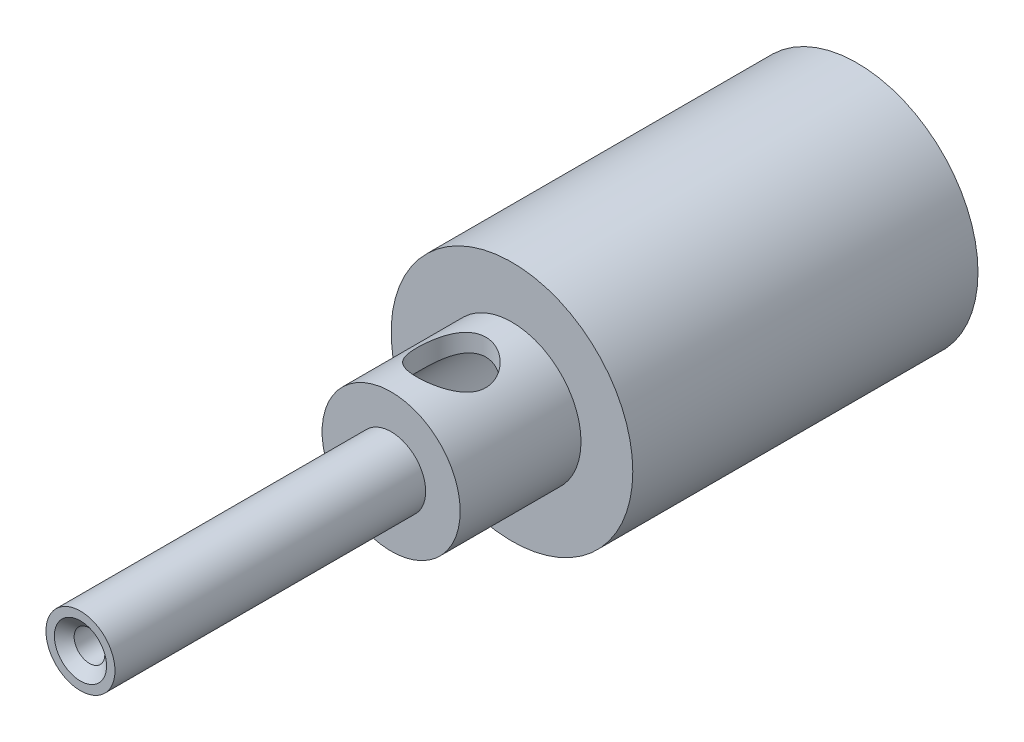
ISO-10303-21;
HEADER;
FILE_DESCRIPTION(('STEP AP214'),'2;1');
FILE_NAME('part.step','',(''),(''),'','','');
FILE_SCHEMA(('AUTOMOTIVE_DESIGN { 1 0 10303 214 1 1 1 1 }'));
ENDSEC;
DATA;
#1=APPLICATION_CONTEXT('core data for automotive mechanical design processes');
#2=APPLICATION_PROTOCOL_DEFINITION('international standard','automotive_design',2000,#1);
#3=PRODUCT_CONTEXT('',#1,'mechanical');
#4=PRODUCT('Part','Part','',(#3));
#5=PRODUCT_RELATED_PRODUCT_CATEGORY('part','',(#4));
#6=PRODUCT_DEFINITION_FORMATION('','',#4);
#7=PRODUCT_DEFINITION_CONTEXT('part definition',#1,'design');
#8=PRODUCT_DEFINITION('design','',#6,#7);
#9=PRODUCT_DEFINITION_SHAPE('','',#8);
#10=(LENGTH_UNIT() NAMED_UNIT(*) SI_UNIT(.MILLI.,.METRE.));
#11=(NAMED_UNIT(*) PLANE_ANGLE_UNIT() SI_UNIT($,.RADIAN.));
#12=(NAMED_UNIT(*) SI_UNIT($,.STERADIAN.) SOLID_ANGLE_UNIT());
#13=UNCERTAINTY_MEASURE_WITH_UNIT(LENGTH_MEASURE(1.E-05),#10,'distance_accuracy_value','');
#14=(GEOMETRIC_REPRESENTATION_CONTEXT(3) GLOBAL_UNCERTAINTY_ASSIGNED_CONTEXT((#13)) GLOBAL_UNIT_ASSIGNED_CONTEXT((#10,
#11,#12)) REPRESENTATION_CONTEXT('',''));
#15=CARTESIAN_POINT('',(0.,0.,0.));
#16=DIRECTION('',(0.,0.,1.));
#17=DIRECTION('',(1.,0.,0.));
#18=AXIS2_PLACEMENT_3D('',#15,#16,#17);
#19=CARTESIAN_POINT('',(0.,32.,23.5116221591236));
#20=DIRECTION('',(0.,-1.,0.));
#21=DIRECTION('',(0.,0.,-1.));
#22=AXIS2_PLACEMENT_3D('',#19,#20,#21);
#23=CYLINDRICAL_SURFACE('',#22,2.);
#24=CARTESIAN_POINT('',(0.,4.,21.5116221591236));
#25=CARTESIAN_POINT('',(-0.105143925902467,3.99999426810082,21.5116287637579));
#26=CARTESIAN_POINT('',(-0.210413199395125,3.99580982039513,21.5199623053657));
#27=CARTESIAN_POINT('',(-0.417840470537792,3.97948312074314,21.5529279198066));
#28=CARTESIAN_POINT('',(-0.519992173427259,3.96732575657839,21.5775909451192));
#29=CARTESIAN_POINT('',(-0.717867089760898,3.93632558806751,21.6420097763568));
#30=CARTESIAN_POINT('',(-0.813613605878293,3.91750878355075,21.6817069276195));
#31=CARTESIAN_POINT('',(-0.996945233613198,3.87491553031523,21.7747634018535));
#32=CARTESIAN_POINT('',(-1.08453098798012,3.8511394726705,21.8281216476213));
#33=CARTESIAN_POINT('',(-1.25501563552382,3.79912516516124,21.9506566580941));
#34=CARTESIAN_POINT('',(-1.33731042224422,3.77070398255074,22.0205951176028));
#35=CARTESIAN_POINT('',(-1.48955888973396,3.71319940493486,22.1726651176176));
#36=CARTESIAN_POINT('',(-1.55950316621354,3.68411552418069,22.2548058626684));
#37=CARTESIAN_POINT('',(-1.69050400090056,3.62597902394695,22.4365888581703));
#38=CARTESIAN_POINT('',(-1.75045067110328,3.59710373940264,22.5370943558154));
#39=CARTESIAN_POINT('',(-1.85233645378139,3.54571957544641,22.748356831096));
#40=CARTESIAN_POINT('',(-1.89428842993267,3.52320615213979,22.8591064165691));
#41=CARTESIAN_POINT('',(-1.95626488437718,3.48915734075617,23.0809523699674));
#42=CARTESIAN_POINT('',(-1.97745171416088,3.47704543167427,23.1916310632584));
#43=CARTESIAN_POINT('',(-2.00085398661769,3.46363779897055,23.4155798346825));
#44=CARTESIAN_POINT('',(-2.00308817674615,3.46233138686576,23.5288472408659));
#45=CARTESIAN_POINT('',(-1.98937457434459,3.47021860514497,23.7401942077543));
#46=CARTESIAN_POINT('',(-1.97556911907364,3.47817527324027,23.8384702215697));
#47=CARTESIAN_POINT('',(-1.93387969811386,3.50152457467701,24.0310659778697));
#48=CARTESIAN_POINT('',(-1.9059912477953,3.51691957663553,24.1253844497342));
#49=CARTESIAN_POINT('',(-1.83641956077201,3.55374952825482,24.3100804242549));
#50=CARTESIAN_POINT('',(-1.79443013423199,3.57531681327997,24.4003149566951));
#51=CARTESIAN_POINT('',(-1.69808337533601,3.62206808562807,24.5728907443036));
#52=CARTESIAN_POINT('',(-1.64372048762494,3.64725369560381,24.6552284303237));
#53=CARTESIAN_POINT('',(-1.51613210982558,3.70226315806572,24.82066466461));
#54=CARTESIAN_POINT('',(-1.44138891673856,3.73227020473492,24.9025359062759));
#55=CARTESIAN_POINT('',(-1.27911115748275,3.79095246600814,25.0530929963054));
#56=CARTESIAN_POINT('',(-1.19157051314857,3.81962703917602,25.1217725431913));
#57=CARTESIAN_POINT('',(-1.0010330116637,3.87403974565928,25.246993481183));
#58=CARTESIAN_POINT('',(-0.897507183198815,3.89957968324014,25.302823104015));
#59=CARTESIAN_POINT('',(-0.680932430977591,3.94315762242485,25.3958162172096));
#60=CARTESIAN_POINT('',(-0.567891152530551,3.96120157887106,25.4329945291539));
#61=CARTESIAN_POINT('',(-0.345532983321405,3.98648667482871,25.4845729665569));
#62=CARTESIAN_POINT('',(-0.236683061096653,3.9944987660262,25.5006046306171));
#63=CARTESIAN_POINT('',(-0.0175591998987033,4.00146026918207,25.5145516213925));
#64=CARTESIAN_POINT('',(0.0927140397398172,4.00041397442637,25.5124755304025));
#65=CARTESIAN_POINT('',(0.302465943971974,3.9898238450687,25.4912087822861));
#66=CARTESIAN_POINT('',(0.402118816099861,3.98094491376337,25.4733570936636));
#67=CARTESIAN_POINT('',(0.596813784603883,3.9564434262968,25.4231460153333));
#68=CARTESIAN_POINT('',(0.691855371382174,3.94082012668824,25.3907850262166));
#69=CARTESIAN_POINT('',(0.877777216899146,3.90368502827176,25.3116252262575));
#70=CARTESIAN_POINT('',(0.968460794011607,3.88201763539261,25.264440058891));
#71=CARTESIAN_POINT('',(1.14092272339854,3.83487948634835,25.1574070878304));
#72=CARTESIAN_POINT('',(1.22269725955318,3.80940711133877,25.0975538899328));
#73=CARTESIAN_POINT('',(1.38353537857843,3.75416442672396,24.9601013084621));
#74=CARTESIAN_POINT('',(1.46154415563805,3.72421769686998,24.8813364222333));
#75=CARTESIAN_POINT('',(1.60371264223771,3.6652478321764,24.7117718565681));
#76=CARTESIAN_POINT('',(1.66786277142375,3.63622534800094,24.6209639214277));
#77=CARTESIAN_POINT('',(1.78341582895804,3.58102384412979,24.4243348507776));
#78=CARTESIAN_POINT('',(1.8340509916005,3.55505059178121,24.3179996269346));
#79=CARTESIAN_POINT('',(1.91616565186941,3.51148144588269,24.0966020239736));
#80=CARTESIAN_POINT('',(1.94766983173403,3.493874764435,23.9815511061898));
#81=CARTESIAN_POINT('',(1.98772337493375,3.47123002051604,23.7578017133542));
#82=CARTESIAN_POINT('',(1.9981859928109,3.4651476693013,23.6495536522531));
#83=CARTESIAN_POINT('',(2.0013783087524,3.46330709283206,23.4327280247945));
#84=CARTESIAN_POINT('',(1.99411569324648,3.4675443925278,23.3241506216478));
#85=CARTESIAN_POINT('',(1.96385225118662,3.48475724102153,23.1206551560567));
#86=CARTESIAN_POINT('',(1.94241662868607,3.49686188965317,23.0254212188341));
#87=CARTESIAN_POINT('',(1.88635071644882,3.52742032375305,22.8400059202748));
#88=CARTESIAN_POINT('',(1.85171618231984,3.54587615139337,22.7498261949395));
#89=CARTESIAN_POINT('',(1.76763149060113,3.58857060729071,22.5703724571505));
#90=CARTESIAN_POINT('',(1.7173422756314,3.61311444791841,22.4815663554655));
#91=CARTESIAN_POINT('',(1.60430194327478,3.66470663269721,22.313073086761));
#92=CARTESIAN_POINT('',(1.54154434248312,3.69175627591221,22.2333906980813));
#93=CARTESIAN_POINT('',(1.39640665332275,3.74924646316184,22.0753381944142));
#94=CARTESIAN_POINT('',(1.31256884599452,3.77969966613256,21.998303954423));
#95=CARTESIAN_POINT('',(1.13230961246639,3.83755504519861,21.859096192253));
#96=CARTESIAN_POINT('',(1.03588144661039,3.8649555725239,21.7969306801837));
#97=CARTESIAN_POINT('',(0.831863193565889,3.91396019133075,21.6891494336994));
#98=CARTESIAN_POINT('',(0.72419900755346,3.93552192987866,21.6436538206506));
#99=CARTESIAN_POINT('',(0.501484202276173,3.97002682597974,21.5720058236087));
#100=CARTESIAN_POINT('',(0.386455599178201,3.98299446726136,21.5457984655121));
#101=CARTESIAN_POINT('',(0.225203892981792,3.99390923826956,21.5238273369521));
#102=CARTESIAN_POINT('',(0.18032375888313,3.99618730680502,21.5192568773909));
#103=CARTESIAN_POINT('',(0.0903034636101831,3.99923393953631,21.5131528280954));
#104=CARTESIAN_POINT('',(0.0451632952932568,4.00000246206762,21.5116193221831));
#105=CARTESIAN_POINT('',(0.,4.,21.5116221591236));
#106=B_SPLINE_CURVE_WITH_KNOTS('',3,(#24,#25,#26,#27,#28,#29,#30,#31,#32,#33,#34,#35,#36,#37,
#38,#39,#40,#41,#42,#43,#44,#45,#46,#47,#48,#49,#50,#51,#52,#53,#54,#55,#56,#57,#58,#59,#60,#61,
#62,#63,#64,#65,#66,#67,#68,#69,#70,#71,#72,#73,#74,#75,#76,#77,#78,#79,#80,#81,#82,#83,#84,#85,
#86,#87,#88,#89,#90,#91,#92,#93,#94,#95,#96,#97,#98,#99,#100,#101,#102,#103,#104,#105),
.UNSPECIFIED.,.T.,.F.,(4,2,2,2,2,2,2,2,2,2,2,2,2,2,2,2,2,2,2,2,2,2,2,2,2,2,2,2,2,2,2,2,2,2,2,2,
2,2,2,2,4),(0.,0.315248514840585,0.631096299418396,0.945724310984597,1.26032752116314,
1.59396351743618,1.92785247530807,2.28763452861506,2.64715895796562,2.98516024280459,
3.32282714658041,3.62011424818642,3.91749607851357,4.22180480336975,4.52625042520444,
4.86929882667757,5.21251069197373,5.57166044428882,5.93052433824559,6.25966580942691,
6.58865129022952,6.89213813012244,7.19565843261863,7.50785712055798,7.82018901496679,
8.16319221288838,8.50643177230864,8.86629364323452,9.22569023890902,9.55058615006093,
9.87534119729357,10.1691586049771,10.463070575767,10.7767291356057,11.0905512228726,
11.4425048551434,11.7946476676249,12.1492802732705,12.502898172423,12.6383056026783,
12.7737167702213),.UNSPECIFIED.);
#107=CARTESIAN_POINT('',(0.,4.,21.5116221591236));
#108=VERTEX_POINT('',#107);
#109=EDGE_CURVE('E63',#108,#108,#106,.T.);
#110=ORIENTED_EDGE('',*,*,#109,.T.);
#111=EDGE_LOOP('',(#110));
#112=FACE_BOUND('',#111,.T.);
#113=CARTESIAN_POINT('',(0.,3.,21.5116221591236));
#114=CARTESIAN_POINT('',(0.100484716668078,3.0000004164484,21.5116216094911));
#115=CARTESIAN_POINT('',(0.200969087132901,2.99490802753388,21.5192361290791));
#116=CARTESIAN_POINT('',(0.398733058031681,2.97504652423809,21.5492190232292));
#117=CARTESIAN_POINT('',(0.496011113955007,2.96027281581235,21.5715944022469));
#118=CARTESIAN_POINT('',(0.684212307854249,2.92250482404708,21.6297298764484));
#119=CARTESIAN_POINT('',(0.775162872657554,2.89954905493315,21.6654272991315));
#120=CARTESIAN_POINT('',(0.94941529099726,2.8472613787744,21.7486855223951));
#121=CARTESIAN_POINT('',(1.03271603160967,2.8179285460551,21.7962480454241));
#122=CARTESIAN_POINT('',(1.19728470077011,2.75227329369838,21.906279096491));
#123=CARTESIAN_POINT('',(1.27778030546068,2.71556897579319,21.9696700198665));
#124=CARTESIAN_POINT('',(1.42772804469274,2.63982313083466,22.107352207782));
#125=CARTESIAN_POINT('',(1.49716405543888,2.60077830356832,22.1816590889613));
#126=CARTESIAN_POINT('',(1.63422297745496,2.51728264678794,22.3526745267362));
#127=CARTESIAN_POINT('',(1.6998318636275,2.47295067937795,22.451067812327));
#128=CARTESIAN_POINT('',(1.81350357014175,2.3908414735282,22.6599855367701));
#129=CARTESIAN_POINT('',(1.86159673426503,2.35305295954668,22.7704885606863));
#130=CARTESIAN_POINT('',(1.92674035011438,2.29976266641461,22.9683334525452));
#131=CARTESIAN_POINT('',(1.94874447236008,2.28097627892403,23.0531506119975));
#132=CARTESIAN_POINT('',(1.98150617785228,2.25257969659604,23.2263666638652));
#133=CARTESIAN_POINT('',(1.99228314651963,2.24295368744147,23.3147591078496));
#134=CARTESIAN_POINT('',(2.00191364141227,2.23436605608045,23.49309693798));
#135=CARTESIAN_POINT('',(2.00071842917524,2.23544802558502,23.583047182576));
#136=CARTESIAN_POINT('',(1.98637581333356,2.24819775483425,23.7612571326233));
#137=CARTESIAN_POINT('',(1.97321828380393,2.25987448286881,23.8495153411517));
#138=CARTESIAN_POINT('',(1.93664994217326,2.29127185989959,24.0180892103654));
#139=CARTESIAN_POINT('',(1.91371711479477,2.31061488324375,24.0985834950623));
#140=CARTESIAN_POINT('',(1.85870118583424,2.35509622933623,24.2546458500993));
#141=CARTESIAN_POINT('',(1.8266150732855,2.3802364585489,24.3302122893622));
#142=CARTESIAN_POINT('',(1.74673818732648,2.43964196377947,24.49064755448));
#143=CARTESIAN_POINT('',(1.69708052300445,2.47472317740626,24.5742820596067));
#144=CARTESIAN_POINT('',(1.58668960438221,2.54691537733438,24.7330055544093));
#145=CARTESIAN_POINT('',(1.52594268999614,2.58402882709328,24.8080838168856));
#146=CARTESIAN_POINT('',(1.37981165322309,2.66543343763724,24.964164704727));
#147=CARTESIAN_POINT('',(1.29193938283656,2.7095474472056,25.0429562078063));
#148=CARTESIAN_POINT('',(1.10200799908008,2.79218100665212,25.184818653662));
#149=CARTESIAN_POINT('',(0.999962299343698,2.83070577648042,25.2479043045325));
#150=CARTESIAN_POINT('',(0.80485782709653,2.89145404090364,25.3450998777464));
#151=CARTESIAN_POINT('',(0.713957643371909,2.9153926116554,25.3824655224625));
#152=CARTESIAN_POINT('',(0.526036043935479,2.95507719030499,25.4437270847489));
#153=CARTESIAN_POINT('',(0.429019879001649,2.97083012127543,25.4676343862558));
#154=CARTESIAN_POINT('',(0.23098545317228,2.99275882156808,25.5007833243616));
#155=CARTESIAN_POINT('',(0.129951811934157,2.99889322461187,25.5099616200618));
#156=CARTESIAN_POINT('',(-0.0724415193893482,3.00083114965147,25.5128692476858));
#157=CARTESIAN_POINT('',(-0.173801186186627,2.99663539385634,25.5065996596123));
#158=CARTESIAN_POINT('',(-0.366455717204241,2.97899589424273,25.4799981035616));
#159=CARTESIAN_POINT('',(-0.457957444679195,2.96622246390226,25.4606848613683));
#160=CARTESIAN_POINT('',(-0.636116392427403,2.93318449284837,25.4100264731107));
#161=CARTESIAN_POINT('',(-0.722772837571135,2.91291875746989,25.3786794081954));
#162=CARTESIAN_POINT('',(-0.894664750465998,2.86496352529158,25.3029698620786));
#163=CARTESIAN_POINT('',(-0.979496184631421,2.83689870135785,25.2579340050417));
#164=CARTESIAN_POINT('',(-1.14068302395729,2.7760185561151,25.1571888691773));
#165=CARTESIAN_POINT('',(-1.21703314820091,2.74320030403941,25.1014729985914));
#166=CARTESIAN_POINT('',(-1.37185445482324,2.6695454665343,24.9710142909661));
#167=CARTESIAN_POINT('',(-1.44875187569565,2.62826156800165,24.8946558990485));
#168=CARTESIAN_POINT('',(-1.58933968069449,2.54571173085958,24.7305107291665));
#169=CARTESIAN_POINT('',(-1.6530209365723,2.50444582417845,24.6427161200161));
#170=CARTESIAN_POINT('',(-1.76124776549313,2.4293967897058,24.4644797463554));
#171=CARTESIAN_POINT('',(-1.80695636125283,2.39527597025701,24.3748901256614));
#172=CARTESIAN_POINT('',(-1.88496213740264,2.33438974266154,24.1877495066799));
#173=CARTESIAN_POINT('',(-1.91728345682189,2.30761112529822,24.0902132208189));
#174=CARTESIAN_POINT('',(-1.9623584346534,2.26933208182633,23.9070576719282));
#175=CARTESIAN_POINT('',(-1.97758597566225,2.25594998021257,23.8224503492476));
#176=CARTESIAN_POINT('',(-1.99699205923373,2.23879466438398,23.6510488778052));
#177=CARTESIAN_POINT('',(-2.00118260285317,2.23501101347816,23.5642572079841));
#178=CARTESIAN_POINT('',(-1.99823921981266,2.23764201149981,23.3909791023999));
#179=CARTESIAN_POINT('',(-1.99109858767783,2.24406269907463,23.3044928777498));
#180=CARTESIAN_POINT('',(-1.96596997224746,2.26610452403491,23.1342786305915));
#181=CARTESIAN_POINT('',(-1.94796751728258,2.28173793527615,23.0505544452992));
#182=CARTESIAN_POINT('',(-1.89593035657494,2.32526843904801,22.8659109726423));
#183=CARTESIAN_POINT('',(-1.85890187130765,2.35532333574983,22.7663544461802));
#184=CARTESIAN_POINT('',(-1.7708452623622,2.42222161121309,22.5761353247394));
#185=CARTESIAN_POINT('',(-1.71979748341259,2.459074496867,22.4854854611319));
#186=CARTESIAN_POINT('',(-1.60398280555152,2.53617186577119,22.3123402719873));
#187=CARTESIAN_POINT('',(-1.53898309894021,2.5764658739228,22.2300234137005));
#188=CARTESIAN_POINT('',(-1.39671768031094,2.65628301537844,22.0762996808656));
#189=CARTESIAN_POINT('',(-1.31944821025748,2.69580590832396,22.0048961620944));
#190=CARTESIAN_POINT('',(-1.14145732976974,2.77631551964082,21.8649100548145));
#191=CARTESIAN_POINT('',(-1.03896166955574,2.81669805449991,21.7982035189452));
#192=CARTESIAN_POINT('',(-0.820868555771212,2.88777665874161,21.6837088824583));
#193=CARTESIAN_POINT('',(-0.705292062449151,2.91848793445255,21.6358910522996));
#194=CARTESIAN_POINT('',(-0.491435069835739,2.96101644836895,21.5704675809598));
#195=CARTESIAN_POINT('',(-0.395012325257916,2.97551480368935,21.5485111200249));
#196=CARTESIAN_POINT('',(-0.199058012023943,2.99500280141853,21.5190941265855));
#197=CARTESIAN_POINT('',(-0.0995288361880063,2.99999958751315,21.5116227035276));
#198=CARTESIAN_POINT('',(0.,3.,21.5116221591236));
#199=B_SPLINE_CURVE_WITH_KNOTS('',3,(#113,#114,#115,#116,#117,#118,#119,#120,#121,#122,#123,
#124,#125,#126,#127,#128,#129,#130,#131,#132,#133,#134,#135,#136,#137,#138,#139,#140,#141,#142,
#143,#144,#145,#146,#147,#148,#149,#150,#151,#152,#153,#154,#155,#156,#157,#158,#159,#160,#161,
#162,#163,#164,#165,#166,#167,#168,#169,#170,#171,#172,#173,#174,#175,#176,#177,#178,#179,#180,
#181,#182,#183,#184,#185,#186,#187,#188,#189,#190,#191,#192,#193,#194,#195,#196,#197,#198),
.UNSPECIFIED.,.T.,.F.,(4,2,2,2,2,2,2,2,2,2,2,2,2,2,2,2,2,2,2,2,2,2,2,2,2,2,2,2,2,2,2,2,2,2,2,2,
2,2,2,2,2,2,4),(0.,0.3010532265054,0.602249414348689,0.902046153190232,1.20188643867386,
1.52717029000557,1.85292411604319,2.23006683295983,2.60655305445439,2.87433693676029,
3.14165767845809,3.41006711735378,3.67870397263352,3.93548862198022,4.19235783805079,
4.50147574660874,4.81097703780057,5.18718954496752,5.56304840301363,5.86524087696758,
6.16717735142814,6.47040883294251,6.77361911533415,7.05553084792473,7.33748755138271,
7.63652346829516,7.93574454945204,8.28228176141291,8.62905753175758,8.94649935304477,
9.26336626640724,9.52324048016135,9.78283200333092,10.0425772028455,10.302669238524,
10.6320660870419,10.9619271337795,11.2977924520448,11.6337608397015,12.0179535155883,
12.4015390656083,12.6999529136675,12.9981423125957),.UNSPECIFIED.);
#200=CARTESIAN_POINT('',(0.,3.,21.5116221591236));
#201=VERTEX_POINT('',#200);
#202=EDGE_CURVE('E110',#201,#201,#199,.T.);
#203=ORIENTED_EDGE('',*,*,#202,.T.);
#204=EDGE_LOOP('',(#203));
#205=FACE_BOUND('',#204,.T.);
#206=ADVANCED_FACE('F34',(#112,#205),#23,.F.);
#207=CARTESIAN_POINT('',(0.,-4.,21.5116221591236));
#208=CARTESIAN_POINT('',(0.105143925902467,-3.99999426810082,21.5116287637579));
#209=CARTESIAN_POINT('',(0.210413199395125,-3.99580982039513,21.5199623053657));
#210=CARTESIAN_POINT('',(0.417840470537792,-3.97948312074314,21.5529279198066));
#211=CARTESIAN_POINT('',(0.519992173427259,-3.96732575657839,21.5775909451192));
#212=CARTESIAN_POINT('',(0.717867089760898,-3.93632558806751,21.6420097763568));
#213=CARTESIAN_POINT('',(0.813613605878293,-3.91750878355075,21.6817069276195));
#214=CARTESIAN_POINT('',(0.996945233613198,-3.87491553031523,21.7747634018535));
#215=CARTESIAN_POINT('',(1.08453098798012,-3.8511394726705,21.8281216476213));
#216=CARTESIAN_POINT('',(1.25501563552382,-3.79912516516124,21.9506566580941));
#217=CARTESIAN_POINT('',(1.33731042224422,-3.77070398255074,22.0205951176028));
#218=CARTESIAN_POINT('',(1.48955888973396,-3.71319940493486,22.1726651176176));
#219=CARTESIAN_POINT('',(1.55950316621354,-3.68411552418069,22.2548058626684));
#220=CARTESIAN_POINT('',(1.69050400090056,-3.62597902394695,22.4365888581703));
#221=CARTESIAN_POINT('',(1.75045067110328,-3.59710373940264,22.5370943558154));
#222=CARTESIAN_POINT('',(1.85233645378139,-3.54571957544641,22.748356831096));
#223=CARTESIAN_POINT('',(1.89428842993267,-3.52320615213979,22.8591064165691));
#224=CARTESIAN_POINT('',(1.95626488437718,-3.48915734075617,23.0809523699674));
#225=CARTESIAN_POINT('',(1.97745171416088,-3.47704543167427,23.1916310632584));
#226=CARTESIAN_POINT('',(2.00085398661769,-3.46363779897055,23.4155798346825));
#227=CARTESIAN_POINT('',(2.00308817674615,-3.46233138686576,23.5288472408659));
#228=CARTESIAN_POINT('',(1.98937457434459,-3.47021860514497,23.7401942077543));
#229=CARTESIAN_POINT('',(1.97556911907364,-3.47817527324027,23.8384702215697));
#230=CARTESIAN_POINT('',(1.93387969811386,-3.50152457467701,24.0310659778697));
#231=CARTESIAN_POINT('',(1.9059912477953,-3.51691957663553,24.1253844497342));
#232=CARTESIAN_POINT('',(1.83641956077201,-3.55374952825482,24.3100804242549));
#233=CARTESIAN_POINT('',(1.79443013423199,-3.57531681327997,24.4003149566951));
#234=CARTESIAN_POINT('',(1.69808337533601,-3.62206808562807,24.5728907443036));
#235=CARTESIAN_POINT('',(1.64372048762494,-3.64725369560381,24.6552284303237));
#236=CARTESIAN_POINT('',(1.51613210982558,-3.70226315806572,24.82066466461));
#237=CARTESIAN_POINT('',(1.44138891673856,-3.73227020473492,24.9025359062759));
#238=CARTESIAN_POINT('',(1.27911115748275,-3.79095246600814,25.0530929963054));
#239=CARTESIAN_POINT('',(1.19157051314857,-3.81962703917602,25.1217725431913));
#240=CARTESIAN_POINT('',(1.0010330116637,-3.87403974565928,25.246993481183));
#241=CARTESIAN_POINT('',(0.897507183198815,-3.89957968324014,25.302823104015));
#242=CARTESIAN_POINT('',(0.680932430977591,-3.94315762242485,25.3958162172096));
#243=CARTESIAN_POINT('',(0.567891152530551,-3.96120157887106,25.4329945291539));
#244=CARTESIAN_POINT('',(0.345532983321405,-3.98648667482871,25.4845729665569));
#245=CARTESIAN_POINT('',(0.236683061096653,-3.9944987660262,25.5006046306171));
#246=CARTESIAN_POINT('',(0.0175591998987033,-4.00146026918207,25.5145516213925));
#247=CARTESIAN_POINT('',(-0.0927140397398172,-4.00041397442637,25.5124755304025));
#248=CARTESIAN_POINT('',(-0.302465943971974,-3.9898238450687,25.4912087822861));
#249=CARTESIAN_POINT('',(-0.402118816099861,-3.98094491376337,25.4733570936636));
#250=CARTESIAN_POINT('',(-0.596813784603883,-3.9564434262968,25.4231460153333));
#251=CARTESIAN_POINT('',(-0.691855371382174,-3.94082012668824,25.3907850262166));
#252=CARTESIAN_POINT('',(-0.877777216899146,-3.90368502827176,25.3116252262575));
#253=CARTESIAN_POINT('',(-0.968460794011607,-3.88201763539261,25.264440058891));
#254=CARTESIAN_POINT('',(-1.14092272339854,-3.83487948634835,25.1574070878304));
#255=CARTESIAN_POINT('',(-1.22269725955318,-3.80940711133877,25.0975538899328));
#256=CARTESIAN_POINT('',(-1.38353537857843,-3.75416442672396,24.9601013084621));
#257=CARTESIAN_POINT('',(-1.46154415563805,-3.72421769686998,24.8813364222333));
#258=CARTESIAN_POINT('',(-1.60371264223771,-3.6652478321764,24.7117718565681));
#259=CARTESIAN_POINT('',(-1.66786277142375,-3.63622534800094,24.6209639214277));
#260=CARTESIAN_POINT('',(-1.78341582895804,-3.58102384412979,24.4243348507776));
#261=CARTESIAN_POINT('',(-1.8340509916005,-3.55505059178121,24.3179996269346));
#262=CARTESIAN_POINT('',(-1.91616565186941,-3.51148144588269,24.0966020239736));
#263=CARTESIAN_POINT('',(-1.94766983173403,-3.493874764435,23.9815511061898));
#264=CARTESIAN_POINT('',(-1.98772337493375,-3.47123002051604,23.7578017133542));
#265=CARTESIAN_POINT('',(-1.9981859928109,-3.4651476693013,23.6495536522531));
#266=CARTESIAN_POINT('',(-2.0013783087524,-3.46330709283206,23.4327280247945));
#267=CARTESIAN_POINT('',(-1.99411569324648,-3.4675443925278,23.3241506216478));
#268=CARTESIAN_POINT('',(-1.96385225118662,-3.48475724102153,23.1206551560567));
#269=CARTESIAN_POINT('',(-1.94241662868607,-3.49686188965317,23.0254212188341));
#270=CARTESIAN_POINT('',(-1.88635071644882,-3.52742032375305,22.8400059202748));
#271=CARTESIAN_POINT('',(-1.85171618231984,-3.54587615139337,22.7498261949395));
#272=CARTESIAN_POINT('',(-1.76763149060113,-3.58857060729071,22.5703724571505));
#273=CARTESIAN_POINT('',(-1.7173422756314,-3.61311444791841,22.4815663554655));
#274=CARTESIAN_POINT('',(-1.60430194327478,-3.66470663269721,22.313073086761));
#275=CARTESIAN_POINT('',(-1.54154434248312,-3.69175627591221,22.2333906980813));
#276=CARTESIAN_POINT('',(-1.39640665332275,-3.74924646316184,22.0753381944142));
#277=CARTESIAN_POINT('',(-1.31256884599452,-3.77969966613256,21.998303954423));
#278=CARTESIAN_POINT('',(-1.13230961246639,-3.83755504519861,21.859096192253));
#279=CARTESIAN_POINT('',(-1.03588144661039,-3.8649555725239,21.7969306801837));
#280=CARTESIAN_POINT('',(-0.831863193565889,-3.91396019133075,21.6891494336994));
#281=CARTESIAN_POINT('',(-0.72419900755346,-3.93552192987866,21.6436538206506));
#282=CARTESIAN_POINT('',(-0.501484202276173,-3.97002682597974,21.5720058236087));
#283=CARTESIAN_POINT('',(-0.386455599178201,-3.98299446726136,21.5457984655121));
#284=CARTESIAN_POINT('',(-0.225203892981792,-3.99390923826956,21.5238273369521));
#285=CARTESIAN_POINT('',(-0.18032375888313,-3.99618730680502,21.5192568773909));
#286=CARTESIAN_POINT('',(-0.0903034636101831,-3.99923393953631,21.5131528280954));
#287=CARTESIAN_POINT('',(-0.0451632952932568,-4.00000246206762,21.5116193221831));
#288=CARTESIAN_POINT('',(0.,-4.,21.5116221591236));
#289=B_SPLINE_CURVE_WITH_KNOTS('',3,(#207,#208,#209,#210,#211,#212,#213,#214,#215,#216,#217,
#218,#219,#220,#221,#222,#223,#224,#225,#226,#227,#228,#229,#230,#231,#232,#233,#234,#235,#236,
#237,#238,#239,#240,#241,#242,#243,#244,#245,#246,#247,#248,#249,#250,#251,#252,#253,#254,#255,
#256,#257,#258,#259,#260,#261,#262,#263,#264,#265,#266,#267,#268,#269,#270,#271,#272,#273,#274,
#275,#276,#277,#278,#279,#280,#281,#282,#283,#284,#285,#286,#287,#288),.UNSPECIFIED.,.T.,.F.,(4,
2,2,2,2,2,2,2,2,2,2,2,2,2,2,2,2,2,2,2,2,2,2,2,2,2,2,2,2,2,2,2,2,2,2,2,2,2,2,2,4),(0.,
0.315248514840585,0.631096299418396,0.945724310984597,1.26032752116314,1.59396351743618,
1.92785247530807,2.28763452861506,2.64715895796562,2.98516024280459,3.32282714658041,
3.62011424818642,3.91749607851357,4.22180480336975,4.52625042520444,4.86929882667757,
5.21251069197373,5.57166044428882,5.93052433824559,6.25966580942691,6.58865129022952,
6.89213813012244,7.19565843261863,7.50785712055798,7.82018901496679,8.16319221288838,
8.50643177230864,8.86629364323452,9.22569023890902,9.55058615006093,9.87534119729357,
10.1691586049771,10.463070575767,10.7767291356057,11.0905512228726,11.4425048551434,
11.7946476676249,12.1492802732705,12.502898172423,12.6383056026783,12.7737167702213),.UNSPECIFIED.);
#290=CARTESIAN_POINT('',(0.,-4.,21.5116221591236));
#291=VERTEX_POINT('',#290);
#292=EDGE_CURVE('E59',#291,#291,#289,.T.);
#293=ORIENTED_EDGE('',*,*,#292,.T.);
#294=EDGE_LOOP('',(#293));
#295=FACE_BOUND('',#294,.T.);
#296=CARTESIAN_POINT('',(0.,-3.,21.5116221591236));
#297=CARTESIAN_POINT('',(-0.100484716668078,-3.0000004164484,21.5116216094911));
#298=CARTESIAN_POINT('',(-0.200969087132901,-2.99490802753388,21.5192361290791));
#299=CARTESIAN_POINT('',(-0.398733058031681,-2.97504652423809,21.5492190232292));
#300=CARTESIAN_POINT('',(-0.496011113955007,-2.96027281581235,21.5715944022469));
#301=CARTESIAN_POINT('',(-0.684212307854249,-2.92250482404708,21.6297298764484));
#302=CARTESIAN_POINT('',(-0.775162872657554,-2.89954905493315,21.6654272991315));
#303=CARTESIAN_POINT('',(-0.94941529099726,-2.8472613787744,21.7486855223951));
#304=CARTESIAN_POINT('',(-1.03271603160967,-2.8179285460551,21.7962480454241));
#305=CARTESIAN_POINT('',(-1.19728470077011,-2.75227329369838,21.906279096491));
#306=CARTESIAN_POINT('',(-1.27778030546068,-2.71556897579319,21.9696700198665));
#307=CARTESIAN_POINT('',(-1.42772804469274,-2.63982313083466,22.107352207782));
#308=CARTESIAN_POINT('',(-1.49716405543888,-2.60077830356832,22.1816590889613));
#309=CARTESIAN_POINT('',(-1.63422297745496,-2.51728264678794,22.3526745267362));
#310=CARTESIAN_POINT('',(-1.6998318636275,-2.47295067937795,22.451067812327));
#311=CARTESIAN_POINT('',(-1.81350357014175,-2.3908414735282,22.6599855367701));
#312=CARTESIAN_POINT('',(-1.86159673426503,-2.35305295954668,22.7704885606863));
#313=CARTESIAN_POINT('',(-1.92674035011438,-2.29976266641461,22.9683334525452));
#314=CARTESIAN_POINT('',(-1.94874447236008,-2.28097627892403,23.0531506119975));
#315=CARTESIAN_POINT('',(-1.98150617785228,-2.25257969659604,23.2263666638652));
#316=CARTESIAN_POINT('',(-1.99228314651963,-2.24295368744147,23.3147591078496));
#317=CARTESIAN_POINT('',(-2.00191364141227,-2.23436605608045,23.49309693798));
#318=CARTESIAN_POINT('',(-2.00071842917524,-2.23544802558502,23.583047182576));
#319=CARTESIAN_POINT('',(-1.98637581333356,-2.24819775483425,23.7612571326233));
#320=CARTESIAN_POINT('',(-1.97321828380393,-2.25987448286881,23.8495153411517));
#321=CARTESIAN_POINT('',(-1.93664994217326,-2.29127185989959,24.0180892103654));
#322=CARTESIAN_POINT('',(-1.91371711479477,-2.31061488324375,24.0985834950623));
#323=CARTESIAN_POINT('',(-1.85870118583424,-2.35509622933623,24.2546458500993));
#324=CARTESIAN_POINT('',(-1.8266150732855,-2.3802364585489,24.3302122893622));
#325=CARTESIAN_POINT('',(-1.74673818732648,-2.43964196377947,24.49064755448));
#326=CARTESIAN_POINT('',(-1.69708052300445,-2.47472317740626,24.5742820596067));
#327=CARTESIAN_POINT('',(-1.58668960438221,-2.54691537733438,24.7330055544093));
#328=CARTESIAN_POINT('',(-1.52594268999614,-2.58402882709328,24.8080838168856));
#329=CARTESIAN_POINT('',(-1.37981165322309,-2.66543343763724,24.964164704727));
#330=CARTESIAN_POINT('',(-1.29193938283656,-2.7095474472056,25.0429562078063));
#331=CARTESIAN_POINT('',(-1.10200799908008,-2.79218100665212,25.184818653662));
#332=CARTESIAN_POINT('',(-0.999962299343698,-2.83070577648042,25.2479043045325));
#333=CARTESIAN_POINT('',(-0.80485782709653,-2.89145404090364,25.3450998777464));
#334=CARTESIAN_POINT('',(-0.713957643371909,-2.9153926116554,25.3824655224625));
#335=CARTESIAN_POINT('',(-0.526036043935479,-2.95507719030499,25.4437270847489));
#336=CARTESIAN_POINT('',(-0.429019879001649,-2.97083012127543,25.4676343862558));
#337=CARTESIAN_POINT('',(-0.23098545317228,-2.99275882156808,25.5007833243616));
#338=CARTESIAN_POINT('',(-0.129951811934157,-2.99889322461187,25.5099616200618));
#339=CARTESIAN_POINT('',(0.0724415193893482,-3.00083114965147,25.5128692476858));
#340=CARTESIAN_POINT('',(0.173801186186627,-2.99663539385634,25.5065996596123));
#341=CARTESIAN_POINT('',(0.366455717204241,-2.97899589424273,25.4799981035616));
#342=CARTESIAN_POINT('',(0.457957444679195,-2.96622246390226,25.4606848613683));
#343=CARTESIAN_POINT('',(0.636116392427403,-2.93318449284837,25.4100264731107));
#344=CARTESIAN_POINT('',(0.722772837571135,-2.91291875746989,25.3786794081954));
#345=CARTESIAN_POINT('',(0.894664750465998,-2.86496352529158,25.3029698620786));
#346=CARTESIAN_POINT('',(0.979496184631421,-2.83689870135785,25.2579340050417));
#347=CARTESIAN_POINT('',(1.14068302395729,-2.7760185561151,25.1571888691773));
#348=CARTESIAN_POINT('',(1.21703314820091,-2.74320030403941,25.1014729985914));
#349=CARTESIAN_POINT('',(1.37185445482324,-2.6695454665343,24.9710142909661));
#350=CARTESIAN_POINT('',(1.44875187569565,-2.62826156800165,24.8946558990485));
#351=CARTESIAN_POINT('',(1.58933968069449,-2.54571173085958,24.7305107291665));
#352=CARTESIAN_POINT('',(1.6530209365723,-2.50444582417845,24.6427161200161));
#353=CARTESIAN_POINT('',(1.76124776549313,-2.4293967897058,24.4644797463554));
#354=CARTESIAN_POINT('',(1.80695636125283,-2.39527597025701,24.3748901256614));
#355=CARTESIAN_POINT('',(1.88496213740264,-2.33438974266154,24.1877495066799));
#356=CARTESIAN_POINT('',(1.91728345682189,-2.30761112529822,24.0902132208189));
#357=CARTESIAN_POINT('',(1.9623584346534,-2.26933208182633,23.9070576719282));
#358=CARTESIAN_POINT('',(1.97758597566225,-2.25594998021257,23.8224503492476));
#359=CARTESIAN_POINT('',(1.99699205923373,-2.23879466438398,23.6510488778052));
#360=CARTESIAN_POINT('',(2.00118260285317,-2.23501101347816,23.5642572079841));
#361=CARTESIAN_POINT('',(1.99823921981266,-2.23764201149981,23.3909791023999));
#362=CARTESIAN_POINT('',(1.99109858767783,-2.24406269907463,23.3044928777498));
#363=CARTESIAN_POINT('',(1.96596997224746,-2.26610452403491,23.1342786305915));
#364=CARTESIAN_POINT('',(1.94796751728258,-2.28173793527615,23.0505544452992));
#365=CARTESIAN_POINT('',(1.89593035657494,-2.32526843904801,22.8659109726423));
#366=CARTESIAN_POINT('',(1.85890187130765,-2.35532333574983,22.7663544461802));
#367=CARTESIAN_POINT('',(1.7708452623622,-2.42222161121309,22.5761353247394));
#368=CARTESIAN_POINT('',(1.71979748341259,-2.459074496867,22.4854854611319));
#369=CARTESIAN_POINT('',(1.60398280555152,-2.53617186577119,22.3123402719873));
#370=CARTESIAN_POINT('',(1.53898309894021,-2.5764658739228,22.2300234137005));
#371=CARTESIAN_POINT('',(1.39671768031094,-2.65628301537844,22.0762996808656));
#372=CARTESIAN_POINT('',(1.31944821025748,-2.69580590832396,22.0048961620944));
#373=CARTESIAN_POINT('',(1.14145732976974,-2.77631551964082,21.8649100548145));
#374=CARTESIAN_POINT('',(1.03896166955574,-2.81669805449991,21.7982035189452));
#375=CARTESIAN_POINT('',(0.820868555771212,-2.88777665874161,21.6837088824583));
#376=CARTESIAN_POINT('',(0.705292062449151,-2.91848793445255,21.6358910522996));
#377=CARTESIAN_POINT('',(0.491435069835739,-2.96101644836895,21.5704675809598));
#378=CARTESIAN_POINT('',(0.395012325257916,-2.97551480368935,21.5485111200249));
#379=CARTESIAN_POINT('',(0.199058012023943,-2.99500280141853,21.5190941265855));
#380=CARTESIAN_POINT('',(0.0995288361880063,-2.99999958751315,21.5116227035276));
#381=CARTESIAN_POINT('',(0.,-3.,21.5116221591236));
#382=B_SPLINE_CURVE_WITH_KNOTS('',3,(#296,#297,#298,#299,#300,#301,#302,#303,#304,#305,#306,
#307,#308,#309,#310,#311,#312,#313,#314,#315,#316,#317,#318,#319,#320,#321,#322,#323,#324,#325,
#326,#327,#328,#329,#330,#331,#332,#333,#334,#335,#336,#337,#338,#339,#340,#341,#342,#343,#344,
#345,#346,#347,#348,#349,#350,#351,#352,#353,#354,#355,#356,#357,#358,#359,#360,#361,#362,#363,
#364,#365,#366,#367,#368,#369,#370,#371,#372,#373,#374,#375,#376,#377,#378,#379,#380,#381),
.UNSPECIFIED.,.T.,.F.,(4,2,2,2,2,2,2,2,2,2,2,2,2,2,2,2,2,2,2,2,2,2,2,2,2,2,2,2,2,2,2,2,2,2,2,2,
2,2,2,2,2,2,4),(0.,0.3010532265054,0.602249414348689,0.902046153190232,1.20188643867386,
1.52717029000557,1.85292411604319,2.23006683295983,2.60655305445439,2.87433693676029,
3.14165767845809,3.41006711735378,3.67870397263352,3.93548862198022,4.19235783805079,
4.50147574660874,4.81097703780057,5.18718954496752,5.56304840301363,5.86524087696758,
6.16717735142814,6.47040883294251,6.77361911533415,7.05553084792473,7.33748755138271,
7.63652346829516,7.93574454945204,8.28228176141291,8.62905753175758,8.94649935304477,
9.26336626640724,9.52324048016135,9.78283200333092,10.0425772028455,10.302669238524,
10.6320660870419,10.9619271337795,11.2977924520448,11.6337608397015,12.0179535155883,
12.4015390656083,12.6999529136675,12.9981423125957),.UNSPECIFIED.);
#383=CARTESIAN_POINT('',(0.,-3.,21.5116221591236));
#384=VERTEX_POINT('',#383);
#385=EDGE_CURVE('E103',#384,#384,#382,.T.);
#386=ORIENTED_EDGE('',*,*,#385,.T.);
#387=EDGE_LOOP('',(#386));
#388=FACE_BOUND('',#387,.T.);
#389=ADVANCED_FACE('F93',(#295,#388),#23,.F.);
#390=CARTESIAN_POINT('',(0.,0.,45.));
#391=DIRECTION('',(0.,0.,1.));
#392=DIRECTION('',(1.,0.,0.));
#393=AXIS2_PLACEMENT_3D('',#390,#391,#392);
#394=CYLINDRICAL_SURFACE('',#393,0.888999999999996);
#395=CARTESIAN_POINT('',(0.,0.,44.4778282995184));
#396=DIRECTION('',(0.,0.,1.));
#397=DIRECTION('',(1.,0.,0.));
#398=AXIS2_PLACEMENT_3D('',#395,#396,#397);
#399=CIRCLE('',#398,0.888999999999998);
#400=CARTESIAN_POINT('',(0.888999999999998,0.,44.4778282995184));
#401=VERTEX_POINT('',#400);
#402=EDGE_CURVE('E56',#401,#401,#399,.T.);
#403=ORIENTED_EDGE('',*,*,#402,.T.);
#404=EDGE_LOOP('',(#403));
#405=FACE_BOUND('',#404,.T.);
#406=CARTESIAN_POINT('',(0.,0.,26.8849430957608));
#407=DIRECTION('',(0.,0.,-1.));
#408=DIRECTION('',(-1.,0.,0.));
#409=AXIS2_PLACEMENT_3D('',#406,#407,#408);
#410=CIRCLE('',#409,0.888999999999996);
#411=CARTESIAN_POINT('',(-0.888999999999996,0.,26.8849430957608));
#412=VERTEX_POINT('',#411);
#413=EDGE_CURVE('E38',#412,#412,#410,.F.);
#414=ORIENTED_EDGE('',*,*,#413,.F.);
#415=EDGE_LOOP('',(#414));
#416=FACE_BOUND('',#415,.T.);
#417=ADVANCED_FACE('F95',(#405,#416),#394,.F.);
#418=CARTESIAN_POINT('',(0.,0.,27.));
#419=DIRECTION('',(0.,0.,-1.));
#420=DIRECTION('',(-1.,0.,0.));
#421=AXIS2_PLACEMENT_3D('',#418,#419,#420);
#422=CYLINDRICAL_SURFACE('',#421,4.);
#423=CARTESIAN_POINT('',(0.,0.,27.));
#424=DIRECTION('',(0.,0.,1.));
#425=DIRECTION('',(1.,0.,0.));
#426=AXIS2_PLACEMENT_3D('',#423,#424,#425);
#427=CIRCLE('',#426,4.);
#428=CARTESIAN_POINT('',(4.,0.,27.));
#429=VERTEX_POINT('',#428);
#430=EDGE_CURVE('E62',#429,#429,#427,.T.);
#431=ORIENTED_EDGE('',*,*,#430,.F.);
#432=EDGE_LOOP('',(#431));
#433=FACE_BOUND('',#432,.T.);
#434=CARTESIAN_POINT('',(0.,0.,20.));
#435=DIRECTION('',(0.,0.,1.));
#436=DIRECTION('',(1.,0.,0.));
#437=AXIS2_PLACEMENT_3D('',#434,#435,#436);
#438=CIRCLE('',#437,4.);
#439=CARTESIAN_POINT('',(4.,0.,20.));
#440=VERTEX_POINT('',#439);
#441=EDGE_CURVE('E47',#440,#440,#438,.T.);
#442=ORIENTED_EDGE('',*,*,#441,.T.);
#443=EDGE_LOOP('',(#442));
#444=FACE_BOUND('',#443,.T.);
#445=ORIENTED_EDGE('',*,*,#292,.F.);
#446=EDGE_LOOP('',(#445));
#447=FACE_BOUND('',#446,.T.);
#448=ORIENTED_EDGE('',*,*,#109,.F.);
#449=EDGE_LOOP('',(#448));
#450=FACE_BOUND('',#449,.T.);
#451=ADVANCED_FACE('F85',(#433,#444,#447,#450),#422,.T.);
#452=CARTESIAN_POINT('',(0.,0.,20.));
#453=DIRECTION('',(0.,0.,-1.));
#454=DIRECTION('',(-1.,0.,0.));
#455=AXIS2_PLACEMENT_3D('',#452,#453,#454);
#456=CYLINDRICAL_SURFACE('',#455,7.);
#457=CARTESIAN_POINT('',(0.,0.,20.));
#458=DIRECTION('',(0.,0.,1.));
#459=DIRECTION('',(1.,0.,0.));
#460=AXIS2_PLACEMENT_3D('',#457,#458,#459);
#461=CIRCLE('',#460,7.);
#462=CARTESIAN_POINT('',(7.,0.,20.));
#463=VERTEX_POINT('',#462);
#464=EDGE_CURVE('E70',#463,#463,#461,.T.);
#465=ORIENTED_EDGE('',*,*,#464,.F.);
#466=EDGE_LOOP('',(#465));
#467=FACE_BOUND('',#466,.T.);
#468=CARTESIAN_POINT('',(0.,0.,0.));
#469=DIRECTION('',(0.,0.,1.));
#470=DIRECTION('',(1.,0.,0.));
#471=AXIS2_PLACEMENT_3D('',#468,#469,#470);
#472=CIRCLE('',#471,7.);
#473=CARTESIAN_POINT('',(7.,0.,0.));
#474=VERTEX_POINT('',#473);
#475=EDGE_CURVE('E67',#474,#474,#472,.T.);
#476=ORIENTED_EDGE('',*,*,#475,.T.);
#477=EDGE_LOOP('',(#476));
#478=FACE_BOUND('',#477,.T.);
#479=ADVANCED_FACE('F36',(#467,#478),#456,.T.);
#480=CARTESIAN_POINT('',(0.,0.,20.));
#481=DIRECTION('',(0.,0.,1.));
#482=DIRECTION('',(1.,0.,0.));
#483=AXIS2_PLACEMENT_3D('',#480,#481,#482);
#484=PLANE('',#483);
#485=ORIENTED_EDGE('',*,*,#441,.F.);
#486=EDGE_LOOP('',(#485));
#487=FACE_BOUND('',#486,.T.);
#488=ORIENTED_EDGE('',*,*,#464,.T.);
#489=EDGE_LOOP('',(#488));
#490=FACE_BOUND('',#489,.T.);
#491=ADVANCED_FACE('F259',(#487,#490),#484,.T.);
#492=CARTESIAN_POINT('',(0.,0.,0.));
#493=DIRECTION('',(0.,0.,1.));
#494=DIRECTION('',(1.,0.,0.));
#495=AXIS2_PLACEMENT_3D('',#492,#493,#494);
#496=PLANE('',#495);
#497=CARTESIAN_POINT('',(0.,0.,0.));
#498=DIRECTION('',(0.,0.,-1.));
#499=DIRECTION('',(-1.,0.,0.));
#500=AXIS2_PLACEMENT_3D('',#497,#498,#499);
#501=CIRCLE('',#500,4.);
#502=CARTESIAN_POINT('',(-4.,0.,0.));
#503=VERTEX_POINT('',#502);
#504=EDGE_CURVE('E10',#503,#503,#501,.T.);
#505=ORIENTED_EDGE('',*,*,#504,.F.);
#506=EDGE_LOOP('',(#505));
#507=FACE_BOUND('',#506,.T.);
#508=ORIENTED_EDGE('',*,*,#475,.F.);
#509=EDGE_LOOP('',(#508));
#510=FACE_BOUND('',#509,.T.);
#511=ADVANCED_FACE('F152',(#507,#510),#496,.F.);
#512=CARTESIAN_POINT('',(0.,0.,27.));
#513=DIRECTION('',(0.,0.,1.));
#514=DIRECTION('',(1.,0.,0.));
#515=AXIS2_PLACEMENT_3D('',#512,#513,#514);
#516=PLANE('',#515);
#517=CARTESIAN_POINT('',(0.,0.,27.));
#518=DIRECTION('',(0.,0.,1.));
#519=DIRECTION('',(1.,0.,0.));
#520=AXIS2_PLACEMENT_3D('',#517,#518,#519);
#521=CIRCLE('',#520,2.);
#522=CARTESIAN_POINT('',(2.,0.,27.));
#523=VERTEX_POINT('',#522);
#524=EDGE_CURVE('E42',#523,#523,#521,.T.);
#525=ORIENTED_EDGE('',*,*,#524,.F.);
#526=EDGE_LOOP('',(#525));
#527=FACE_BOUND('',#526,.T.);
#528=ORIENTED_EDGE('',*,*,#430,.T.);
#529=EDGE_LOOP('',(#528));
#530=FACE_BOUND('',#529,.T.);
#531=ADVANCED_FACE('F147',(#527,#530),#516,.T.);
#532=CARTESIAN_POINT('',(0.,0.,45.));
#533=DIRECTION('',(0.,0.,-1.));
#534=DIRECTION('',(-1.,0.,0.));
#535=AXIS2_PLACEMENT_3D('',#532,#533,#534);
#536=CYLINDRICAL_SURFACE('',#535,2.);
#537=CARTESIAN_POINT('',(0.,0.,45.));
#538=DIRECTION('',(0.,0.,1.));
#539=DIRECTION('',(1.,0.,0.));
#540=AXIS2_PLACEMENT_3D('',#537,#538,#539);
#541=CIRCLE('',#540,2.);
#542=CARTESIAN_POINT('',(2.,0.,45.));
#543=VERTEX_POINT('',#542);
#544=EDGE_CURVE('E60',#543,#543,#541,.T.);
#545=ORIENTED_EDGE('',*,*,#544,.F.);
#546=EDGE_LOOP('',(#545));
#547=FACE_BOUND('',#546,.T.);
#548=ORIENTED_EDGE('',*,*,#524,.T.);
#549=EDGE_LOOP('',(#548));
#550=FACE_BOUND('',#549,.T.);
#551=ADVANCED_FACE('F137',(#547,#550),#536,.T.);
#552=CARTESIAN_POINT('',(0.,0.,45.));
#553=DIRECTION('',(0.,0.,1.));
#554=DIRECTION('',(1.,0.,0.));
#555=AXIS2_PLACEMENT_3D('',#552,#553,#554);
#556=PLANE('',#555);
#557=CARTESIAN_POINT('',(0.,0.,45.));
#558=DIRECTION('',(0.,0.,1.));
#559=DIRECTION('',(1.,0.,0.));
#560=AXIS2_PLACEMENT_3D('',#557,#558,#559);
#561=CIRCLE('',#560,1.5113);
#562=CARTESIAN_POINT('',(1.5113,0.,45.));
#563=VERTEX_POINT('',#562);
#564=EDGE_CURVE('E53',#563,#563,#561,.T.);
#565=ORIENTED_EDGE('',*,*,#564,.F.);
#566=EDGE_LOOP('',(#565));
#567=FACE_BOUND('',#566,.T.);
#568=ORIENTED_EDGE('',*,*,#544,.T.);
#569=EDGE_LOOP('',(#568));
#570=FACE_BOUND('',#569,.T.);
#571=ADVANCED_FACE('F97',(#567,#570),#556,.T.);
#572=CARTESIAN_POINT('',(0.,0.,45.));
#573=DIRECTION('',(0.,0.,1.));
#574=DIRECTION('',(1.,0.,0.));
#575=AXIS2_PLACEMENT_3D('',#572,#573,#574);
#576=CONICAL_SURFACE('',#575,1.5113,0.872664625997169);
#577=ORIENTED_EDGE('',*,*,#402,.F.);
#578=EDGE_LOOP('',(#577));
#579=FACE_BOUND('',#578,.T.);
#580=ORIENTED_EDGE('',*,*,#564,.T.);
#581=EDGE_LOOP('',(#580));
#582=FACE_BOUND('',#581,.T.);
#583=ADVANCED_FACE('F130',(#579,#582),#576,.F.);
#584=CARTESIAN_POINT('',(0.,0.,-1.));
#585=DIRECTION('',(0.,0.,1.));
#586=DIRECTION('',(1.,0.,0.));
#587=AXIS2_PLACEMENT_3D('',#584,#585,#586);
#588=CYLINDRICAL_SURFACE('',#587,4.);
#589=CARTESIAN_POINT('',(0.,0.,-1.));
#590=DIRECTION('',(0.,0.,-1.));
#591=DIRECTION('',(-1.,0.,0.));
#592=AXIS2_PLACEMENT_3D('',#589,#590,#591);
#593=CIRCLE('',#592,4.);
#594=CARTESIAN_POINT('',(-4.,0.,-1.));
#595=VERTEX_POINT('',#594);
#596=EDGE_CURVE('E51',#595,#595,#593,.T.);
#597=ORIENTED_EDGE('',*,*,#596,.F.);
#598=EDGE_LOOP('',(#597));
#599=FACE_BOUND('',#598,.T.);
#600=ORIENTED_EDGE('',*,*,#504,.T.);
#601=EDGE_LOOP('',(#600));
#602=FACE_BOUND('',#601,.T.);
#603=ADVANCED_FACE('F127',(#599,#602),#588,.T.);
#604=CARTESIAN_POINT('',(0.,0.,-1.));
#605=DIRECTION('',(0.,0.,-1.));
#606=DIRECTION('',(-1.,0.,0.));
#607=AXIS2_PLACEMENT_3D('',#604,#605,#606);
#608=PLANE('',#607);
#609=CARTESIAN_POINT('',(0.,0.,-1.));
#610=DIRECTION('',(0.,0.,-1.));
#611=DIRECTION('',(-1.,0.,0.));
#612=AXIS2_PLACEMENT_3D('',#609,#610,#611);
#613=CIRCLE('',#612,3.);
#614=CARTESIAN_POINT('',(-3.,0.,-1.));
#615=VERTEX_POINT('',#614);
#616=EDGE_CURVE('E111',#615,#615,#613,.F.);
#617=ORIENTED_EDGE('',*,*,#616,.T.);
#618=EDGE_LOOP('',(#617));
#619=FACE_BOUND('',#618,.T.);
#620=ORIENTED_EDGE('',*,*,#596,.T.);
#621=EDGE_LOOP('',(#620));
#622=FACE_BOUND('',#621,.T.);
#623=ADVANCED_FACE('F123',(#619,#622),#608,.T.);
#624=CARTESIAN_POINT('',(0.,0.,26.8849430957608));
#625=DIRECTION('',(0.,0.,-1.));
#626=DIRECTION('',(-1.,0.,0.));
#627=AXIS2_PLACEMENT_3D('',#624,#625,#626);
#628=PLANE('',#627);
#629=CARTESIAN_POINT('',(0.,0.,26.8849430957608));
#630=DIRECTION('',(0.,0.,-1.));
#631=DIRECTION('',(-1.,0.,0.));
#632=AXIS2_PLACEMENT_3D('',#629,#630,#631);
#633=CIRCLE('',#632,3.);
#634=CARTESIAN_POINT('',(-3.,0.,26.8849430957608));
#635=VERTEX_POINT('',#634);
#636=EDGE_CURVE('E112',#635,#635,#633,.T.);
#637=ORIENTED_EDGE('',*,*,#636,.T.);
#638=EDGE_LOOP('',(#637));
#639=FACE_BOUND('',#638,.T.);
#640=ORIENTED_EDGE('',*,*,#413,.T.);
#641=EDGE_LOOP('',(#640));
#642=FACE_BOUND('',#641,.T.);
#643=ADVANCED_FACE('F121',(#639,#642),#628,.T.);
#644=CARTESIAN_POINT('',(0.,0.,-8.));
#645=DIRECTION('',(0.,0.,1.));
#646=DIRECTION('',(1.,0.,0.));
#647=AXIS2_PLACEMENT_3D('',#644,#645,#646);
#648=CYLINDRICAL_SURFACE('',#647,3.);
#649=ORIENTED_EDGE('',*,*,#202,.F.);
#650=EDGE_LOOP('',(#649));
#651=FACE_BOUND('',#650,.T.);
#652=ORIENTED_EDGE('',*,*,#385,.F.);
#653=EDGE_LOOP('',(#652));
#654=FACE_BOUND('',#653,.T.);
#655=ORIENTED_EDGE('',*,*,#616,.F.);
#656=EDGE_LOOP('',(#655));
#657=FACE_BOUND('',#656,.T.);
#658=ORIENTED_EDGE('',*,*,#636,.F.);
#659=EDGE_LOOP('',(#658));
#660=FACE_BOUND('',#659,.T.);
#661=ADVANCED_FACE('F116',(#651,#654,#657,#660),#648,.F.);
#662=CLOSED_SHELL('',(#206,#389,#417,#451,#479,#491,#511,#531,#551,#571,#583,#603,#623,#643,#661));
#663=MANIFOLD_SOLID_BREP('B2',#662);
#664=ADVANCED_BREP_SHAPE_REPRESENTATION('',(#18,#663),#14);
#665=SHAPE_DEFINITION_REPRESENTATION(#9,#664);
ENDSEC;
END-ISO-10303-21;
